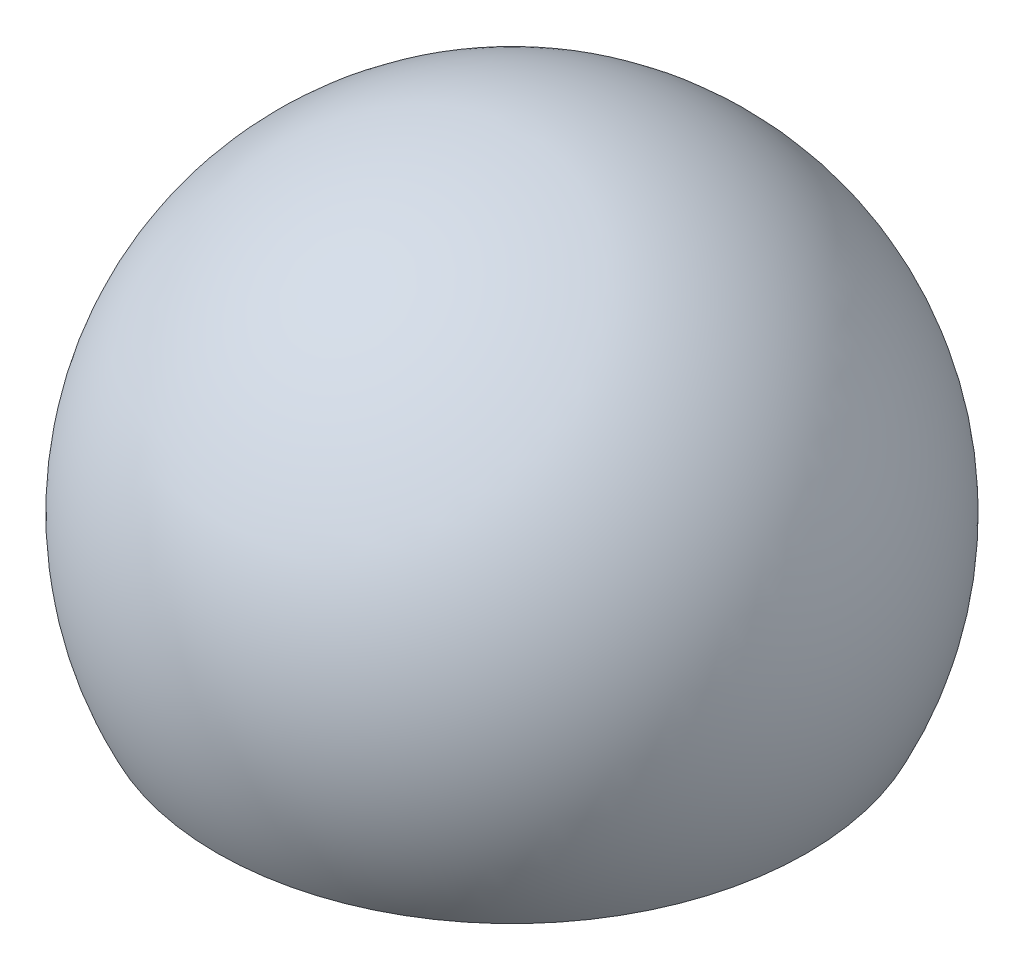
ISO-10303-21;
HEADER;
FILE_DESCRIPTION(('STEP AP214'),'2;1');
FILE_NAME('part.step','',(''),(''),'','','');
FILE_SCHEMA(('AUTOMOTIVE_DESIGN { 1 0 10303 214 1 1 1 1 }'));
ENDSEC;
DATA;
#1=APPLICATION_CONTEXT('core data for automotive mechanical design processes');
#2=APPLICATION_PROTOCOL_DEFINITION('international standard','automotive_design',2000,#1);
#3=PRODUCT_CONTEXT('',#1,'mechanical');
#4=PRODUCT('Part','Part','',(#3));
#5=PRODUCT_RELATED_PRODUCT_CATEGORY('part','',(#4));
#6=PRODUCT_DEFINITION_FORMATION('','',#4);
#7=PRODUCT_DEFINITION_CONTEXT('part definition',#1,'design');
#8=PRODUCT_DEFINITION('design','',#6,#7);
#9=PRODUCT_DEFINITION_SHAPE('','',#8);
#10=(LENGTH_UNIT() NAMED_UNIT(*) SI_UNIT(.MILLI.,.METRE.));
#11=(NAMED_UNIT(*) PLANE_ANGLE_UNIT() SI_UNIT($,.RADIAN.));
#12=(NAMED_UNIT(*) SI_UNIT($,.STERADIAN.) SOLID_ANGLE_UNIT());
#13=UNCERTAINTY_MEASURE_WITH_UNIT(LENGTH_MEASURE(1.E-05),#10,'distance_accuracy_value','');
#14=(GEOMETRIC_REPRESENTATION_CONTEXT(3) GLOBAL_UNCERTAINTY_ASSIGNED_CONTEXT((#13)) GLOBAL_UNIT_ASSIGNED_CONTEXT((#10,
#11,#12)) REPRESENTATION_CONTEXT('',''));
#15=CARTESIAN_POINT('',(0.,0.,0.));
#16=DIRECTION('',(0.,0.,1.));
#17=DIRECTION('',(1.,0.,0.));
#18=AXIS2_PLACEMENT_3D('',#15,#16,#17);
#19=CARTESIAN_POINT('',(0.,4.,0.));
#20=DIRECTION('',(0.,-1.,0.));
#21=DIRECTION('',(1.,0.,0.));
#22=AXIS2_PLACEMENT_3D('',#19,#20,#21);
#23=SPHERICAL_SURFACE('',#22,8.94427190999916);
#24=CARTESIAN_POINT('',(0.,0.,0.));
#25=DIRECTION('',(0.,-1.,0.));
#26=DIRECTION('',(0.,0.,-1.));
#27=AXIS2_PLACEMENT_3D('',#24,#25,#26);
#28=CIRCLE('',#27,8.);
#29=CARTESIAN_POINT('',(0.,0.,-8.));
#30=VERTEX_POINT('',#29);
#31=EDGE_CURVE('E11',#30,#30,#28,.T.);
#32=ORIENTED_EDGE('',*,*,#31,.F.);
#33=EDGE_LOOP('',(#32));
#34=FACE_BOUND('',#33,.T.);
#35=ADVANCED_FACE('F36',(#34),#23,.T.);
#36=CARTESIAN_POINT('',(-8.,0.,0.));
#37=DIRECTION('',(0.,1.,0.));
#38=DIRECTION('',(0.,0.,1.));
#39=AXIS2_PLACEMENT_3D('',#36,#37,#38);
#40=PLANE('',#39);
#41=DIRECTION('',(1.,0.,0.));
#42=VECTOR('',#41,1.);
#43=CARTESIAN_POINT('',(-4.,0.,-4.));
#44=LINE('',#43,#42);
#45=CARTESIAN_POINT('',(-4.,0.,-4.));
#46=VERTEX_POINT('',#45);
#47=CARTESIAN_POINT('',(4.,0.,-4.));
#48=VERTEX_POINT('',#47);
#49=EDGE_CURVE('E84',#46,#48,#44,.T.);
#50=ORIENTED_EDGE('',*,*,#49,.F.);
#51=DIRECTION('',(0.,0.,-1.));
#52=VECTOR('',#51,1.);
#53=CARTESIAN_POINT('',(-4.,0.,-4.));
#54=LINE('',#53,#52);
#55=CARTESIAN_POINT('',(-4.,0.,4.));
#56=VERTEX_POINT('',#55);
#57=EDGE_CURVE('E50',#56,#46,#54,.T.);
#58=ORIENTED_EDGE('',*,*,#57,.F.);
#59=DIRECTION('',(-1.,0.,0.));
#60=VECTOR('',#59,1.);
#61=CARTESIAN_POINT('',(-4.,0.,4.));
#62=LINE('',#61,#60);
#63=CARTESIAN_POINT('',(4.,0.,4.));
#64=VERTEX_POINT('',#63);
#65=EDGE_CURVE('E100',#64,#56,#62,.T.);
#66=ORIENTED_EDGE('',*,*,#65,.F.);
#67=DIRECTION('',(0.,0.,1.));
#68=VECTOR('',#67,1.);
#69=CARTESIAN_POINT('',(4.,0.,-4.));
#70=LINE('',#69,#68);
#71=EDGE_CURVE('E106',#48,#64,#70,.T.);
#72=ORIENTED_EDGE('',*,*,#71,.F.);
#73=EDGE_LOOP('',(#50,#58,#66,#72));
#74=FACE_BOUND('',#73,.T.);
#75=ORIENTED_EDGE('',*,*,#31,.T.);
#76=EDGE_LOOP('',(#75));
#77=FACE_BOUND('',#76,.T.);
#78=ADVANCED_FACE('F111',(#74,#77),#40,.F.);
#79=CARTESIAN_POINT('',(-4.,8.,-4.));
#80=DIRECTION('',(-1.,0.,0.));
#81=DIRECTION('',(0.,0.,1.));
#82=AXIS2_PLACEMENT_3D('',#79,#80,#81);
#83=PLANE('',#82);
#84=ORIENTED_EDGE('',*,*,#57,.T.);
#85=DIRECTION('',(0.,-1.,0.));
#86=VECTOR('',#85,1.);
#87=CARTESIAN_POINT('',(-4.,8.,-4.));
#88=LINE('',#87,#86);
#89=CARTESIAN_POINT('',(-4.,8.,-4.));
#90=VERTEX_POINT('',#89);
#91=EDGE_CURVE('E72',#90,#46,#88,.T.);
#92=ORIENTED_EDGE('',*,*,#91,.F.);
#93=DIRECTION('',(0.,0.,-1.));
#94=VECTOR('',#93,1.);
#95=CARTESIAN_POINT('',(-4.,8.,-4.));
#96=LINE('',#95,#94);
#97=CARTESIAN_POINT('',(-4.,8.,4.));
#98=VERTEX_POINT('',#97);
#99=EDGE_CURVE('E98',#98,#90,#96,.T.);
#100=ORIENTED_EDGE('',*,*,#99,.F.);
#101=DIRECTION('',(0.,-1.,0.));
#102=VECTOR('',#101,1.);
#103=CARTESIAN_POINT('',(-4.,8.,4.));
#104=LINE('',#103,#102);
#105=EDGE_CURVE('E43',#98,#56,#104,.T.);
#106=ORIENTED_EDGE('',*,*,#105,.T.);
#107=EDGE_LOOP('',(#84,#92,#100,#106));
#108=FACE_BOUND('',#107,.T.);
#109=ADVANCED_FACE('F116',(#108),#83,.F.);
#110=CARTESIAN_POINT('',(-4.,8.,4.));
#111=DIRECTION('',(0.,0.,1.));
#112=DIRECTION('',(1.,0.,0.));
#113=AXIS2_PLACEMENT_3D('',#110,#111,#112);
#114=PLANE('',#113);
#115=ORIENTED_EDGE('',*,*,#65,.T.);
#116=ORIENTED_EDGE('',*,*,#105,.F.);
#117=DIRECTION('',(-1.,0.,0.));
#118=VECTOR('',#117,1.);
#119=CARTESIAN_POINT('',(-4.,8.,4.));
#120=LINE('',#119,#118);
#121=CARTESIAN_POINT('',(4.,8.,4.));
#122=VERTEX_POINT('',#121);
#123=EDGE_CURVE('E95',#122,#98,#120,.T.);
#124=ORIENTED_EDGE('',*,*,#123,.F.);
#125=DIRECTION('',(0.,-1.,0.));
#126=VECTOR('',#125,1.);
#127=CARTESIAN_POINT('',(4.,8.,4.));
#128=LINE('',#127,#126);
#129=EDGE_CURVE('E88',#122,#64,#128,.T.);
#130=ORIENTED_EDGE('',*,*,#129,.T.);
#131=EDGE_LOOP('',(#115,#116,#124,#130));
#132=FACE_BOUND('',#131,.T.);
#133=ADVANCED_FACE('F114',(#132),#114,.F.);
#134=CARTESIAN_POINT('',(4.,8.,-4.));
#135=DIRECTION('',(1.,0.,0.));
#136=DIRECTION('',(0.,0.,-1.));
#137=AXIS2_PLACEMENT_3D('',#134,#135,#136);
#138=PLANE('',#137);
#139=ORIENTED_EDGE('',*,*,#71,.T.);
#140=ORIENTED_EDGE('',*,*,#129,.F.);
#141=DIRECTION('',(0.,0.,1.));
#142=VECTOR('',#141,1.);
#143=CARTESIAN_POINT('',(4.,8.,-4.));
#144=LINE('',#143,#142);
#145=CARTESIAN_POINT('',(4.,8.,-4.));
#146=VERTEX_POINT('',#145);
#147=EDGE_CURVE('E91',#146,#122,#144,.T.);
#148=ORIENTED_EDGE('',*,*,#147,.F.);
#149=DIRECTION('',(0.,-1.,0.));
#150=VECTOR('',#149,1.);
#151=CARTESIAN_POINT('',(4.,8.,-4.));
#152=LINE('',#151,#150);
#153=EDGE_CURVE('E77',#146,#48,#152,.T.);
#154=ORIENTED_EDGE('',*,*,#153,.T.);
#155=EDGE_LOOP('',(#139,#140,#148,#154));
#156=FACE_BOUND('',#155,.T.);
#157=ADVANCED_FACE('F92',(#156),#138,.F.);
#158=CARTESIAN_POINT('',(-4.,8.,-4.));
#159=DIRECTION('',(0.,0.,-1.));
#160=DIRECTION('',(-1.,0.,0.));
#161=AXIS2_PLACEMENT_3D('',#158,#159,#160);
#162=PLANE('',#161);
#163=ORIENTED_EDGE('',*,*,#49,.T.);
#164=ORIENTED_EDGE('',*,*,#153,.F.);
#165=DIRECTION('',(1.,0.,0.));
#166=VECTOR('',#165,1.);
#167=CARTESIAN_POINT('',(-4.,8.,-4.));
#168=LINE('',#167,#166);
#169=EDGE_CURVE('E81',#90,#146,#168,.T.);
#170=ORIENTED_EDGE('',*,*,#169,.F.);
#171=ORIENTED_EDGE('',*,*,#91,.T.);
#172=EDGE_LOOP('',(#163,#164,#170,#171));
#173=FACE_BOUND('',#172,.T.);
#174=ADVANCED_FACE('F79',(#173),#162,.F.);
#175=CARTESIAN_POINT('',(0.,8.,0.));
#176=DIRECTION('',(0.,1.,0.));
#177=DIRECTION('',(0.,0.,1.));
#178=AXIS2_PLACEMENT_3D('',#175,#176,#177);
#179=PLANE('',#178);
#180=ORIENTED_EDGE('',*,*,#99,.T.);
#181=ORIENTED_EDGE('',*,*,#169,.T.);
#182=ORIENTED_EDGE('',*,*,#147,.T.);
#183=ORIENTED_EDGE('',*,*,#123,.T.);
#184=EDGE_LOOP('',(#180,#181,#182,#183));
#185=FACE_BOUND('',#184,.T.);
#186=ADVANCED_FACE('F97',(#185),#179,.F.);
#187=CLOSED_SHELL('',(#35,#78,#109,#133,#157,#174,#186));
#188=MANIFOLD_SOLID_BREP('B2',#187);
#189=ADVANCED_BREP_SHAPE_REPRESENTATION('',(#18,#188),#14);
#190=SHAPE_DEFINITION_REPRESENTATION(#9,#189);
ENDSEC;
END-ISO-10303-21;
